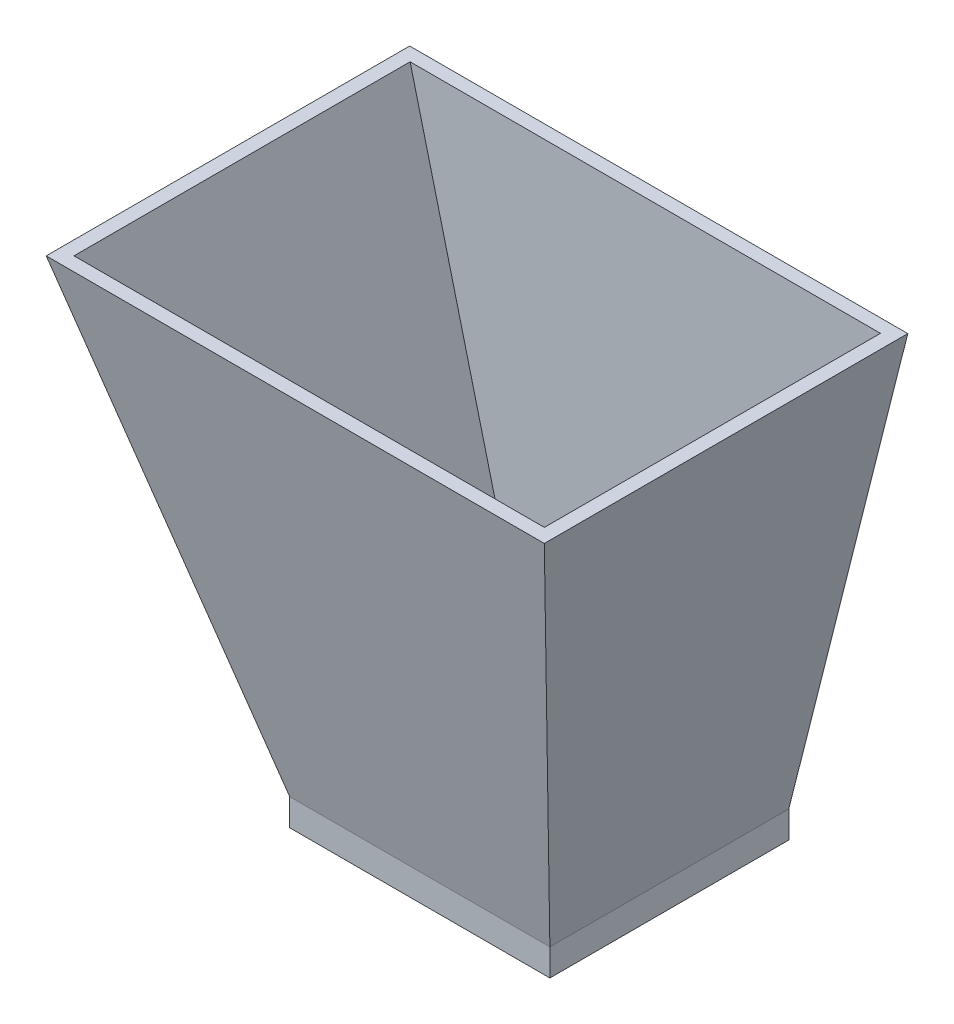
ISO-10303-21;
HEADER;
FILE_DESCRIPTION(('STEP AP214'),'2;1');
FILE_NAME('part.step','',(''),(''),'','','');
FILE_SCHEMA(('AUTOMOTIVE_DESIGN { 1 0 10303 214 1 1 1 1 }'));
ENDSEC;
DATA;
#1=APPLICATION_CONTEXT('core data for automotive mechanical design processes');
#2=APPLICATION_PROTOCOL_DEFINITION('international standard','automotive_design',2000,#1);
#3=PRODUCT_CONTEXT('',#1,'mechanical');
#4=PRODUCT('Part','Part','',(#3));
#5=PRODUCT_RELATED_PRODUCT_CATEGORY('part','',(#4));
#6=PRODUCT_DEFINITION_FORMATION('','',#4);
#7=PRODUCT_DEFINITION_CONTEXT('part definition',#1,'design');
#8=PRODUCT_DEFINITION('design','',#6,#7);
#9=PRODUCT_DEFINITION_SHAPE('','',#8);
#10=(LENGTH_UNIT() NAMED_UNIT(*) SI_UNIT(.MILLI.,.METRE.));
#11=(NAMED_UNIT(*) PLANE_ANGLE_UNIT() SI_UNIT($,.RADIAN.));
#12=(NAMED_UNIT(*) SI_UNIT($,.STERADIAN.) SOLID_ANGLE_UNIT());
#13=UNCERTAINTY_MEASURE_WITH_UNIT(LENGTH_MEASURE(1.E-05),#10,'distance_accuracy_value','');
#14=(GEOMETRIC_REPRESENTATION_CONTEXT(3) GLOBAL_UNCERTAINTY_ASSIGNED_CONTEXT((#13)) GLOBAL_UNIT_ASSIGNED_CONTEXT((#10,
#11,#12)) REPRESENTATION_CONTEXT('',''));
#15=CARTESIAN_POINT('',(0.,0.,0.));
#16=DIRECTION('',(0.,0.,1.));
#17=DIRECTION('',(1.,0.,0.));
#18=AXIS2_PLACEMENT_3D('',#15,#16,#17);
#19=CARTESIAN_POINT('',(-21.9202613203939,-5.08,19.9127549930525));
#20=DIRECTION('',(0.,0.,1.));
#21=DIRECTION('',(1.,0.,0.));
#22=AXIS2_PLACEMENT_3D('',#19,#20,#21);
#23=PLANE('',#22);
#24=DIRECTION('',(0.,1.,0.));
#25=VECTOR('',#24,1.);
#26=CARTESIAN_POINT('',(21.9202613203939,-5.08,19.9127549930525));
#27=LINE('',#26,#25);
#28=CARTESIAN_POINT('',(21.9202613203939,0.,19.9127549930525));
#29=VERTEX_POINT('',#28);
#30=CARTESIAN_POINT('',(21.9202613203939,-5.08,19.9127549930525));
#31=VERTEX_POINT('',#30);
#32=EDGE_CURVE('E19',#29,#31,#27,.F.);
#33=ORIENTED_EDGE('',*,*,#32,.T.);
#34=DIRECTION('',(1.,0.,0.));
#35=VECTOR('',#34,1.);
#36=CARTESIAN_POINT('',(0.,-5.08,19.9127549930525));
#37=LINE('',#36,#35);
#38=CARTESIAN_POINT('',(-21.9202613203939,-5.08,19.9127549930525));
#39=VERTEX_POINT('',#38);
#40=EDGE_CURVE('E107',#39,#31,#37,.T.);
#41=ORIENTED_EDGE('',*,*,#40,.F.);
#42=DIRECTION('',(0.,1.,0.));
#43=VECTOR('',#42,1.);
#44=CARTESIAN_POINT('',(-21.9202613203939,-5.08,19.9127549930525));
#45=LINE('',#44,#43);
#46=CARTESIAN_POINT('',(-21.9202613203939,0.,19.9127549930525));
#47=VERTEX_POINT('',#46);
#48=EDGE_CURVE('E113',#39,#47,#45,.T.);
#49=ORIENTED_EDGE('',*,*,#48,.T.);
#50=DIRECTION('',(1.,0.,0.));
#51=VECTOR('',#50,1.);
#52=CARTESIAN_POINT('',(0.,0.,19.9127549930525));
#53=LINE('',#52,#51);
#54=EDGE_CURVE('E165',#29,#47,#53,.F.);
#55=ORIENTED_EDGE('',*,*,#54,.F.);
#56=EDGE_LOOP('',(#33,#41,#49,#55));
#57=FACE_BOUND('',#56,.T.);
#58=ADVANCED_FACE('F16',(#57),#23,.F.);
#59=CARTESIAN_POINT('',(21.9202613203939,-5.08,-20.));
#60=DIRECTION('',(1.,0.,0.));
#61=DIRECTION('',(0.,0.,-1.));
#62=AXIS2_PLACEMENT_3D('',#59,#60,#61);
#63=PLANE('',#62);
#64=DIRECTION('',(0.,0.,1.));
#65=VECTOR('',#64,1.);
#66=CARTESIAN_POINT('',(21.9202613203939,0.,0.));
#67=LINE('',#66,#65);
#68=CARTESIAN_POINT('',(21.9202613203939,0.,-20.));
#69=VERTEX_POINT('',#68);
#70=CARTESIAN_POINT('',(21.9202613203939,0.,-22.54));
#71=VERTEX_POINT('',#70);
#72=EDGE_CURVE('E125',#69,#71,#67,.F.);
#73=ORIENTED_EDGE('',*,*,#72,.T.);
#74=DIRECTION('',(0.,1.,0.));
#75=VECTOR('',#74,1.);
#76=CARTESIAN_POINT('',(21.9202613203939,0.,-22.54));
#77=LINE('',#76,#75);
#78=CARTESIAN_POINT('',(21.9202613203939,-5.08,-22.54));
#79=VERTEX_POINT('',#78);
#80=EDGE_CURVE('E145',#79,#71,#77,.T.);
#81=ORIENTED_EDGE('',*,*,#80,.F.);
#82=DIRECTION('',(0.,0.,-1.));
#83=VECTOR('',#82,1.);
#84=CARTESIAN_POINT('',(21.9202613203939,-5.08,0.));
#85=LINE('',#84,#83);
#86=EDGE_CURVE('E132',#31,#79,#85,.T.);
#87=ORIENTED_EDGE('',*,*,#86,.F.);
#88=ORIENTED_EDGE('',*,*,#32,.F.);
#89=DIRECTION('',(0.,0.,1.));
#90=VECTOR('',#89,1.);
#91=CARTESIAN_POINT('',(21.9202613203939,0.,0.));
#92=LINE('',#91,#90);
#93=EDGE_CURVE('E147',#29,#69,#92,.F.);
#94=ORIENTED_EDGE('',*,*,#93,.T.);
#95=EDGE_LOOP('',(#73,#81,#87,#88,#94));
#96=FACE_BOUND('',#95,.T.);
#97=ADVANCED_FACE('F144',(#96),#63,.F.);
#98=CARTESIAN_POINT('',(0.,0.,0.));
#99=DIRECTION('',(0.,1.,0.));
#100=DIRECTION('',(0.,0.,1.));
#101=AXIS2_PLACEMENT_3D('',#98,#99,#100);
#102=PLANE('',#101);
#103=DIRECTION('',(1.,0.,0.));
#104=VECTOR('',#103,1.);
#105=CARTESIAN_POINT('',(0.,0.,-20.));
#106=LINE('',#105,#104);
#107=CARTESIAN_POINT('',(-21.9202613203939,0.,-20.));
#108=VERTEX_POINT('',#107);
#109=EDGE_CURVE('E177',#69,#108,#106,.F.);
#110=ORIENTED_EDGE('',*,*,#109,.T.);
#111=DIRECTION('',(0.,0.,1.));
#112=VECTOR('',#111,1.);
#113=CARTESIAN_POINT('',(-21.9202613203939,0.,-20.));
#114=LINE('',#113,#112);
#115=CARTESIAN_POINT('',(-21.9202613203939,0.,-22.54));
#116=VERTEX_POINT('',#115);
#117=EDGE_CURVE('E124',#108,#116,#114,.F.);
#118=ORIENTED_EDGE('',*,*,#117,.T.);
#119=DIRECTION('',(1.,0.,0.));
#120=VECTOR('',#119,1.);
#121=CARTESIAN_POINT('',(0.,0.,-22.54));
#122=LINE('',#121,#120);
#123=EDGE_CURVE('E151',#71,#116,#122,.F.);
#124=ORIENTED_EDGE('',*,*,#123,.F.);
#125=ORIENTED_EDGE('',*,*,#72,.F.);
#126=EDGE_LOOP('',(#110,#118,#124,#125));
#127=FACE_BOUND('',#126,.T.);
#128=ADVANCED_FACE('F152',(#127),#102,.F.);
#129=CARTESIAN_POINT('',(-21.9202613203939,-5.08,-20.));
#130=DIRECTION('',(-1.,0.,0.));
#131=DIRECTION('',(0.,0.,1.));
#132=AXIS2_PLACEMENT_3D('',#129,#130,#131);
#133=PLANE('',#132);
#134=DIRECTION('',(0.,0.,1.));
#135=VECTOR('',#134,1.);
#136=CARTESIAN_POINT('',(-21.9202613203939,0.,0.));
#137=LINE('',#136,#135);
#138=EDGE_CURVE('E119',#47,#108,#137,.F.);
#139=ORIENTED_EDGE('',*,*,#138,.F.);
#140=ORIENTED_EDGE('',*,*,#48,.F.);
#141=DIRECTION('',(0.,0.,-1.));
#142=VECTOR('',#141,1.);
#143=CARTESIAN_POINT('',(-21.9202613203939,-5.08,0.));
#144=LINE('',#143,#142);
#145=CARTESIAN_POINT('',(-21.9202613203939,-5.08,-22.54));
#146=VERTEX_POINT('',#145);
#147=EDGE_CURVE('E116',#146,#39,#144,.F.);
#148=ORIENTED_EDGE('',*,*,#147,.F.);
#149=DIRECTION('',(0.,1.,0.));
#150=VECTOR('',#149,1.);
#151=CARTESIAN_POINT('',(-21.9202613203939,0.,-22.54));
#152=LINE('',#151,#150);
#153=EDGE_CURVE('E154',#116,#146,#152,.F.);
#154=ORIENTED_EDGE('',*,*,#153,.F.);
#155=ORIENTED_EDGE('',*,*,#117,.F.);
#156=EDGE_LOOP('',(#139,#140,#148,#154,#155));
#157=FACE_BOUND('',#156,.T.);
#158=ADVANCED_FACE('F114',(#157),#133,.F.);
#159=CARTESIAN_POINT('',(0.,-5.08,0.));
#160=DIRECTION('',(0.,-1.,0.));
#161=DIRECTION('',(0.,0.,-1.));
#162=AXIS2_PLACEMENT_3D('',#159,#160,#161);
#163=PLANE('',#162);
#164=DIRECTION('',(1.,0.,0.));
#165=VECTOR('',#164,1.);
#166=CARTESIAN_POINT('',(0.,-5.08,-22.54));
#167=LINE('',#166,#165);
#168=CARTESIAN_POINT('',(24.539999974,-5.08,-22.54));
#169=VERTEX_POINT('',#168);
#170=EDGE_CURVE('E157',#169,#79,#167,.F.);
#171=ORIENTED_EDGE('',*,*,#170,.F.);
#172=DIRECTION('',(0.,0.,1.));
#173=VECTOR('',#172,1.);
#174=CARTESIAN_POINT('',(24.539999974,-5.08,-22.54));
#175=LINE('',#174,#173);
#176=CARTESIAN_POINT('',(24.539999974,-5.08,22.54));
#177=VERTEX_POINT('',#176);
#178=EDGE_CURVE('E194',#169,#177,#175,.T.);
#179=ORIENTED_EDGE('',*,*,#178,.T.);
#180=DIRECTION('',(-1.,0.,0.));
#181=VECTOR('',#180,1.);
#182=CARTESIAN_POINT('',(24.539999974,-5.08,22.54));
#183=LINE('',#182,#181);
#184=CARTESIAN_POINT('',(-24.539999974,-5.08,22.54));
#185=VERTEX_POINT('',#184);
#186=EDGE_CURVE('E182',#177,#185,#183,.T.);
#187=ORIENTED_EDGE('',*,*,#186,.T.);
#188=DIRECTION('',(0.,0.,-1.));
#189=VECTOR('',#188,1.);
#190=CARTESIAN_POINT('',(-24.539999974,-5.08,22.54));
#191=LINE('',#190,#189);
#192=CARTESIAN_POINT('',(-24.539999974,-5.08,-22.54));
#193=VERTEX_POINT('',#192);
#194=EDGE_CURVE('E134',#185,#193,#191,.T.);
#195=ORIENTED_EDGE('',*,*,#194,.T.);
#196=DIRECTION('',(1.,0.,0.));
#197=VECTOR('',#196,1.);
#198=CARTESIAN_POINT('',(0.,-5.08,-22.54));
#199=LINE('',#198,#197);
#200=EDGE_CURVE('E129',#146,#193,#199,.F.);
#201=ORIENTED_EDGE('',*,*,#200,.F.);
#202=ORIENTED_EDGE('',*,*,#147,.T.);
#203=ORIENTED_EDGE('',*,*,#40,.T.);
#204=ORIENTED_EDGE('',*,*,#86,.T.);
#205=EDGE_LOOP('',(#171,#179,#187,#195,#201,#202,#203,#204));
#206=FACE_BOUND('',#205,.T.);
#207=ADVANCED_FACE('F127',(#206),#163,.T.);
#208=CARTESIAN_POINT('',(-24.539999974,-5.08,22.54));
#209=DIRECTION('',(1.,0.,0.));
#210=DIRECTION('',(0.,0.,-1.));
#211=AXIS2_PLACEMENT_3D('',#208,#209,#210);
#212=PLANE('',#211);
#213=DIRECTION('',(0.,1.,0.));
#214=VECTOR('',#213,1.);
#215=CARTESIAN_POINT('',(-24.539999974,0.,-22.54));
#216=LINE('',#215,#214);
#217=CARTESIAN_POINT('',(-24.539999974,0.,-22.54));
#218=VERTEX_POINT('',#217);
#219=EDGE_CURVE('E187',#193,#218,#216,.T.);
#220=ORIENTED_EDGE('',*,*,#219,.F.);
#221=ORIENTED_EDGE('',*,*,#194,.F.);
#222=DIRECTION('',(0.,1.,0.));
#223=VECTOR('',#222,1.);
#224=CARTESIAN_POINT('',(-24.539999974,-5.08,22.54));
#225=LINE('',#224,#223);
#226=CARTESIAN_POINT('',(-24.539999974,0.,22.54));
#227=VERTEX_POINT('',#226);
#228=EDGE_CURVE('E202',#185,#227,#225,.T.);
#229=ORIENTED_EDGE('',*,*,#228,.T.);
#230=DIRECTION('',(0.,0.,1.));
#231=VECTOR('',#230,1.);
#232=CARTESIAN_POINT('',(-24.539999974,0.,0.));
#233=LINE('',#232,#231);
#234=EDGE_CURVE('E189',#227,#218,#233,.F.);
#235=ORIENTED_EDGE('',*,*,#234,.T.);
#236=EDGE_LOOP('',(#220,#221,#229,#235));
#237=FACE_BOUND('',#236,.T.);
#238=ADVANCED_FACE('F188',(#237),#212,.F.);
#239=CARTESIAN_POINT('',(-20.6061674361026,-5.20369470726956,0.));
#240=DIRECTION('',(0.969562363216524,0.244844489082335,0.));
#241=DIRECTION('',(-0.244844489082335,0.969562363216524,0.));
#242=AXIS2_PLACEMENT_3D('',#239,#240,#241);
#243=PLANE('',#242);
#244=DIRECTION('',(-0.244844489082335,0.969562363216524,0.));
#245=VECTOR('',#244,1.);
#246=CARTESIAN_POINT('',(-21.9202613203939,0.,-20.));
#247=LINE('',#246,#245);
#248=CARTESIAN_POINT('',(-44.3702613463939,88.9,-20.));
#249=VERTEX_POINT('',#248);
#250=EDGE_CURVE('E174',#108,#249,#247,.T.);
#251=ORIENTED_EDGE('',*,*,#250,.T.);
#252=DIRECTION('',(0.,0.,1.));
#253=VECTOR('',#252,1.);
#254=CARTESIAN_POINT('',(-44.3702613463939,88.9,0.));
#255=LINE('',#254,#253);
#256=CARTESIAN_POINT('',(-44.3702613463939,88.9,43.4127549930525));
#257=VERTEX_POINT('',#256);
#258=EDGE_CURVE('E207',#257,#249,#255,.F.);
#259=ORIENTED_EDGE('',*,*,#258,.F.);
#260=DIRECTION('',(-0.237178527131381,0.939205836862378,0.248271509181843));
#261=VECTOR('',#260,1.);
#262=CARTESIAN_POINT('',(-21.9202613203939,0.,19.9127549930525));
#263=LINE('',#262,#261);
#264=EDGE_CURVE('E163',#47,#257,#263,.T.);
#265=ORIENTED_EDGE('',*,*,#264,.F.);
#266=ORIENTED_EDGE('',*,*,#138,.T.);
#267=EDGE_LOOP('',(#251,#259,#265,#266));
#268=FACE_BOUND('',#267,.T.);
#269=ADVANCED_FACE('F283',(#268),#243,.T.);
#270=CARTESIAN_POINT('',(0.,0.,-20.));
#271=DIRECTION('',(0.,0.,-1.));
#272=DIRECTION('',(0.,1.,0.));
#273=AXIS2_PLACEMENT_3D('',#270,#271,#272);
#274=PLANE('',#273);
#275=ORIENTED_EDGE('',*,*,#109,.F.);
#276=DIRECTION('',(0.244844489082335,0.969562363216524,0.));
#277=VECTOR('',#276,1.);
#278=CARTESIAN_POINT('',(20.6061674361026,-5.20369470726955,-20.));
#279=LINE('',#278,#277);
#280=CARTESIAN_POINT('',(44.3702613463939,88.9,-20.));
#281=VERTEX_POINT('',#280);
#282=EDGE_CURVE('E170',#69,#281,#279,.T.);
#283=ORIENTED_EDGE('',*,*,#282,.T.);
#284=DIRECTION('',(1.,0.,0.));
#285=VECTOR('',#284,1.);
#286=CARTESIAN_POINT('',(0.,88.9,-20.));
#287=LINE('',#286,#285);
#288=EDGE_CURVE('E209',#249,#281,#287,.T.);
#289=ORIENTED_EDGE('',*,*,#288,.F.);
#290=ORIENTED_EDGE('',*,*,#250,.F.);
#291=EDGE_LOOP('',(#275,#283,#289,#290));
#292=FACE_BOUND('',#291,.T.);
#293=ADVANCED_FACE('F279',(#292),#274,.F.);
#294=CARTESIAN_POINT('',(20.6061674361026,-5.20369470726955,0.));
#295=DIRECTION('',(0.969562363216524,-0.244844489082335,0.));
#296=DIRECTION('',(0.244844489082335,0.969562363216524,0.));
#297=AXIS2_PLACEMENT_3D('',#294,#295,#296);
#298=PLANE('',#297);
#299=ORIENTED_EDGE('',*,*,#93,.F.);
#300=DIRECTION('',(-0.23717852713138,-0.939205836862378,-0.248271509181843));
#301=VECTOR('',#300,1.);
#302=CARTESIAN_POINT('',(44.3702613463939,88.9,43.4127549930525));
#303=LINE('',#302,#301);
#304=CARTESIAN_POINT('',(44.3702613463939,88.9,43.4127549930525));
#305=VERTEX_POINT('',#304);
#306=EDGE_CURVE('E167',#305,#29,#303,.T.);
#307=ORIENTED_EDGE('',*,*,#306,.F.);
#308=DIRECTION('',(0.,0.,1.));
#309=VECTOR('',#308,1.);
#310=CARTESIAN_POINT('',(44.3702613463939,88.9,0.));
#311=LINE('',#310,#309);
#312=EDGE_CURVE('E211',#281,#305,#311,.T.);
#313=ORIENTED_EDGE('',*,*,#312,.F.);
#314=ORIENTED_EDGE('',*,*,#282,.F.);
#315=EDGE_LOOP('',(#299,#307,#313,#314));
#316=FACE_BOUND('',#315,.T.);
#317=ADVANCED_FACE('F275',(#316),#298,.F.);
#318=CARTESIAN_POINT('',(0.,-4.9199844944847,18.6121966621145));
#319=DIRECTION('',(0.,0.255563744398806,-0.966792207534205));
#320=DIRECTION('',(0.,0.966792207534205,0.255563744398806));
#321=AXIS2_PLACEMENT_3D('',#318,#319,#320);
#322=PLANE('',#321);
#323=ORIENTED_EDGE('',*,*,#264,.T.);
#324=DIRECTION('',(1.,0.,0.));
#325=VECTOR('',#324,1.);
#326=CARTESIAN_POINT('',(0.,88.9,43.4127549930525));
#327=LINE('',#326,#325);
#328=EDGE_CURVE('E213',#305,#257,#327,.F.);
#329=ORIENTED_EDGE('',*,*,#328,.F.);
#330=ORIENTED_EDGE('',*,*,#306,.T.);
#331=ORIENTED_EDGE('',*,*,#54,.T.);
#332=EDGE_LOOP('',(#323,#329,#330,#331));
#333=FACE_BOUND('',#332,.T.);
#334=ADVANCED_FACE('F272',(#333),#322,.T.);
#335=CARTESIAN_POINT('',(0.,0.,-22.54));
#336=DIRECTION('',(0.,0.,-1.));
#337=DIRECTION('',(0.,1.,0.));
#338=AXIS2_PLACEMENT_3D('',#335,#336,#337);
#339=PLANE('',#338);
#340=ORIENTED_EDGE('',*,*,#200,.T.);
#341=ORIENTED_EDGE('',*,*,#219,.T.);
#342=DIRECTION('',(-0.244844489082335,0.969562363216524,0.));
#343=VECTOR('',#342,1.);
#344=CARTESIAN_POINT('',(-23.0688558386726,-5.82559970953869,-22.54));
#345=LINE('',#344,#343);
#346=CARTESIAN_POINT('',(-46.99,88.9,-22.54));
#347=VERTEX_POINT('',#346);
#348=EDGE_CURVE('E205',#218,#347,#345,.T.);
#349=ORIENTED_EDGE('',*,*,#348,.T.);
#350=DIRECTION('',(1.,0.,0.));
#351=VECTOR('',#350,1.);
#352=CARTESIAN_POINT('',(0.,88.9,-22.54));
#353=LINE('',#352,#351);
#354=CARTESIAN_POINT('',(46.99,88.9,-22.54));
#355=VERTEX_POINT('',#354);
#356=EDGE_CURVE('E218',#355,#347,#353,.F.);
#357=ORIENTED_EDGE('',*,*,#356,.F.);
#358=DIRECTION('',(0.244844489082335,0.969562363216524,0.));
#359=VECTOR('',#358,1.);
#360=CARTESIAN_POINT('',(23.0688558386726,-5.82559970953869,-22.54));
#361=LINE('',#360,#359);
#362=CARTESIAN_POINT('',(24.539999974,0.,-22.54));
#363=VERTEX_POINT('',#362);
#364=EDGE_CURVE('E221',#363,#355,#361,.T.);
#365=ORIENTED_EDGE('',*,*,#364,.F.);
#366=DIRECTION('',(0.,1.,0.));
#367=VECTOR('',#366,1.);
#368=CARTESIAN_POINT('',(24.539999974,-5.08,-22.54));
#369=LINE('',#368,#367);
#370=EDGE_CURVE('E191',#363,#169,#369,.F.);
#371=ORIENTED_EDGE('',*,*,#370,.T.);
#372=ORIENTED_EDGE('',*,*,#170,.T.);
#373=ORIENTED_EDGE('',*,*,#80,.T.);
#374=ORIENTED_EDGE('',*,*,#123,.T.);
#375=ORIENTED_EDGE('',*,*,#153,.T.);
#376=EDGE_LOOP('',(#340,#341,#349,#357,#365,#371,#372,#373,#374,#375));
#377=FACE_BOUND('',#376,.T.);
#378=ADVANCED_FACE('F269',(#377),#339,.T.);
#379=CARTESIAN_POINT('',(24.539999974,-5.08,-22.54));
#380=DIRECTION('',(-1.,0.,0.));
#381=DIRECTION('',(0.,0.,1.));
#382=AXIS2_PLACEMENT_3D('',#379,#380,#381);
#383=PLANE('',#382);
#384=DIRECTION('',(0.,1.,0.));
#385=VECTOR('',#384,1.);
#386=CARTESIAN_POINT('',(24.539999974,-5.08,22.54));
#387=LINE('',#386,#385);
#388=CARTESIAN_POINT('',(24.539999974,0.,22.54));
#389=VERTEX_POINT('',#388);
#390=EDGE_CURVE('E198',#389,#177,#387,.F.);
#391=ORIENTED_EDGE('',*,*,#390,.T.);
#392=ORIENTED_EDGE('',*,*,#178,.F.);
#393=ORIENTED_EDGE('',*,*,#370,.F.);
#394=DIRECTION('',(0.,0.,1.));
#395=VECTOR('',#394,1.);
#396=CARTESIAN_POINT('',(24.539999974,0.,0.));
#397=LINE('',#396,#395);
#398=EDGE_CURVE('E224',#389,#363,#397,.F.);
#399=ORIENTED_EDGE('',*,*,#398,.F.);
#400=EDGE_LOOP('',(#391,#392,#393,#399));
#401=FACE_BOUND('',#400,.T.);
#402=ADVANCED_FACE('F249',(#401),#383,.F.);
#403=CARTESIAN_POINT('',(24.539999974,-5.08,22.54));
#404=DIRECTION('',(0.,0.,-1.));
#405=DIRECTION('',(-1.,0.,0.));
#406=AXIS2_PLACEMENT_3D('',#403,#404,#405);
#407=PLANE('',#406);
#408=ORIENTED_EDGE('',*,*,#228,.F.);
#409=ORIENTED_EDGE('',*,*,#186,.F.);
#410=ORIENTED_EDGE('',*,*,#390,.F.);
#411=DIRECTION('',(1.,0.,0.));
#412=VECTOR('',#411,1.);
#413=CARTESIAN_POINT('',(0.,0.,22.54));
#414=LINE('',#413,#412);
#415=EDGE_CURVE('E227',#389,#227,#414,.F.);
#416=ORIENTED_EDGE('',*,*,#415,.T.);
#417=EDGE_LOOP('',(#408,#409,#410,#416));
#418=FACE_BOUND('',#417,.T.);
#419=ADVANCED_FACE('F246',(#418),#407,.F.);
#420=CARTESIAN_POINT('',(-23.0688558386726,-5.82559970953869,0.));
#421=DIRECTION('',(0.969562363216524,0.244844489082335,0.));
#422=DIRECTION('',(-0.244844489082335,0.969562363216524,0.));
#423=AXIS2_PLACEMENT_3D('',#420,#421,#422);
#424=PLANE('',#423);
#425=DIRECTION('',(0.,0.,1.));
#426=VECTOR('',#425,1.);
#427=CARTESIAN_POINT('',(-46.99,88.9,0.));
#428=LINE('',#427,#426);
#429=CARTESIAN_POINT('',(-46.99,88.9,46.04));
#430=VERTEX_POINT('',#429);
#431=EDGE_CURVE('E216',#347,#430,#428,.T.);
#432=ORIENTED_EDGE('',*,*,#431,.F.);
#433=ORIENTED_EDGE('',*,*,#348,.F.);
#434=ORIENTED_EDGE('',*,*,#234,.F.);
#435=DIRECTION('',(-0.237178527131381,0.939205836862378,0.248271509181843));
#436=VECTOR('',#435,1.);
#437=CARTESIAN_POINT('',(-24.539999974,0.,22.54));
#438=LINE('',#437,#436);
#439=EDGE_CURVE('E230',#227,#430,#438,.T.);
#440=ORIENTED_EDGE('',*,*,#439,.T.);
#441=EDGE_LOOP('',(#432,#433,#434,#440));
#442=FACE_BOUND('',#441,.T.);
#443=ADVANCED_FACE('F244',(#442),#424,.F.);
#444=CARTESIAN_POINT('',(0.,88.9,0.));
#445=DIRECTION('',(0.,1.,0.));
#446=DIRECTION('',(0.,0.,1.));
#447=AXIS2_PLACEMENT_3D('',#444,#445,#446);
#448=PLANE('',#447);
#449=DIRECTION('',(0.,0.,1.));
#450=VECTOR('',#449,1.);
#451=CARTESIAN_POINT('',(46.99,88.9,0.));
#452=LINE('',#451,#450);
#453=CARTESIAN_POINT('',(46.99,88.9,46.04));
#454=VERTEX_POINT('',#453);
#455=EDGE_CURVE('E33',#355,#454,#452,.T.);
#456=ORIENTED_EDGE('',*,*,#455,.F.);
#457=ORIENTED_EDGE('',*,*,#356,.T.);
#458=ORIENTED_EDGE('',*,*,#431,.T.);
#459=DIRECTION('',(1.,0.,0.));
#460=VECTOR('',#459,1.);
#461=CARTESIAN_POINT('',(0.,88.9,46.04));
#462=LINE('',#461,#460);
#463=EDGE_CURVE('E25',#430,#454,#462,.T.);
#464=ORIENTED_EDGE('',*,*,#463,.T.);
#465=EDGE_LOOP('',(#456,#457,#458,#464));
#466=FACE_BOUND('',#465,.T.);
#467=ORIENTED_EDGE('',*,*,#312,.T.);
#468=ORIENTED_EDGE('',*,*,#328,.T.);
#469=ORIENTED_EDGE('',*,*,#258,.T.);
#470=ORIENTED_EDGE('',*,*,#288,.T.);
#471=EDGE_LOOP('',(#467,#468,#469,#470));
#472=FACE_BOUND('',#471,.T.);
#473=ADVANCED_FACE('F236',(#466,#472),#448,.T.);
#474=CARTESIAN_POINT('',(23.0688558386726,-5.82559970953869,0.));
#475=DIRECTION('',(0.969562363216524,-0.244844489082335,0.));
#476=DIRECTION('',(0.244844489082335,0.969562363216524,0.));
#477=AXIS2_PLACEMENT_3D('',#474,#475,#476);
#478=PLANE('',#477);
#479=DIRECTION('',(-0.23717852713138,-0.939205836862378,-0.248271509181843));
#480=VECTOR('',#479,1.);
#481=CARTESIAN_POINT('',(46.99,88.9,46.04));
#482=LINE('',#481,#480);
#483=EDGE_CURVE('E11',#454,#389,#482,.T.);
#484=ORIENTED_EDGE('',*,*,#483,.T.);
#485=ORIENTED_EDGE('',*,*,#398,.T.);
#486=ORIENTED_EDGE('',*,*,#364,.T.);
#487=ORIENTED_EDGE('',*,*,#455,.T.);
#488=EDGE_LOOP('',(#484,#485,#486,#487));
#489=FACE_BOUND('',#488,.T.);
#490=ADVANCED_FACE('F252',(#489),#478,.T.);
#491=CARTESIAN_POINT('',(0.,-5.56911640525767,21.0678488692514));
#492=DIRECTION('',(0.,0.255563744398806,-0.966792207534205));
#493=DIRECTION('',(0.,0.966792207534205,0.255563744398806));
#494=AXIS2_PLACEMENT_3D('',#491,#492,#493);
#495=PLANE('',#494);
#496=ORIENTED_EDGE('',*,*,#463,.F.);
#497=ORIENTED_EDGE('',*,*,#439,.F.);
#498=ORIENTED_EDGE('',*,*,#415,.F.);
#499=ORIENTED_EDGE('',*,*,#483,.F.);
#500=EDGE_LOOP('',(#496,#497,#498,#499));
#501=FACE_BOUND('',#500,.T.);
#502=ADVANCED_FACE('F241',(#501),#495,.F.);
#503=CLOSED_SHELL('',(#58,#97,#128,#158,#207,#238,#269,#293,#317,#334,#378,#402,#419,#443,#473,
#490,#502));
#504=MANIFOLD_SOLID_BREP('B1',#503);
#505=ADVANCED_BREP_SHAPE_REPRESENTATION('',(#18,#504),#14);
#506=SHAPE_DEFINITION_REPRESENTATION(#9,#505);
ENDSEC;
END-ISO-10303-21;
